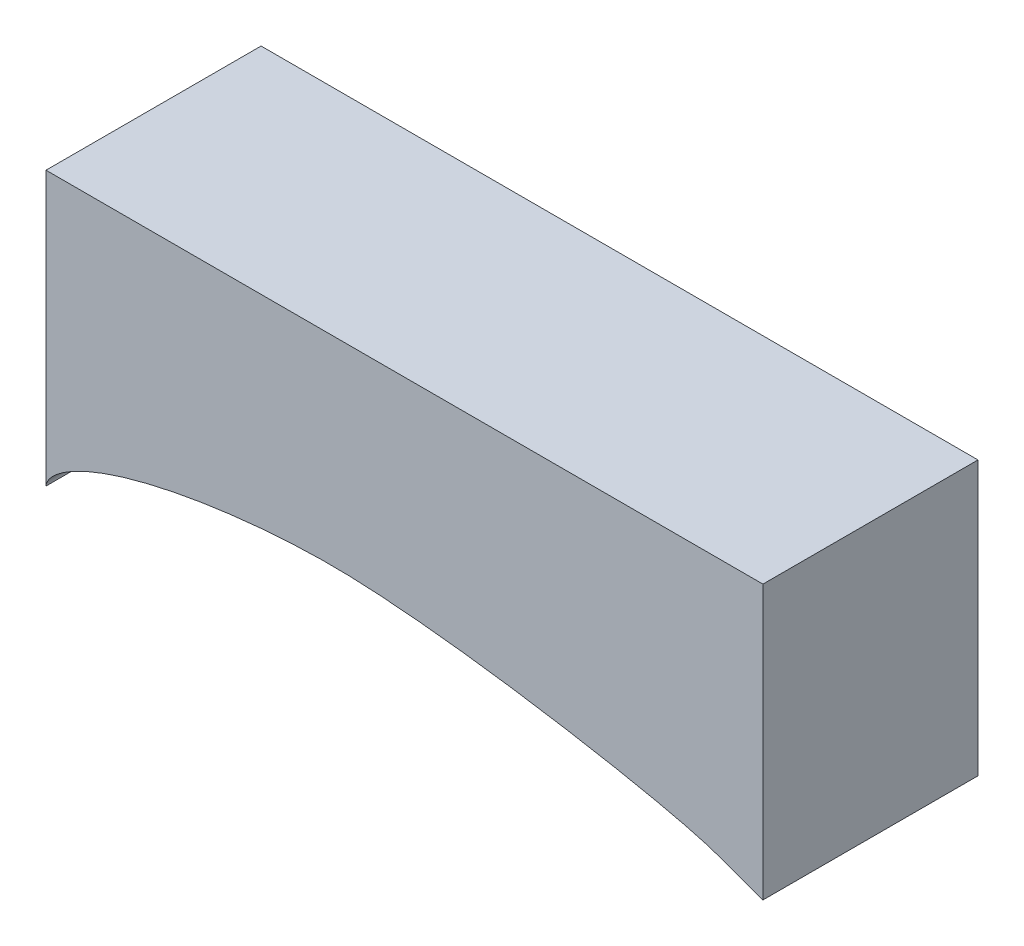
ISO-10303-21;
HEADER;
FILE_DESCRIPTION(('STEP AP214'),'2;1');
FILE_NAME('part.step','',(''),(''),'','','');
FILE_SCHEMA(('AUTOMOTIVE_DESIGN { 1 0 10303 214 1 1 1 1 }'));
ENDSEC;
DATA;
#1=APPLICATION_CONTEXT('core data for automotive mechanical design processes');
#2=APPLICATION_PROTOCOL_DEFINITION('international standard','automotive_design',2000,#1);
#3=PRODUCT_CONTEXT('',#1,'mechanical');
#4=PRODUCT('Part','Part','',(#3));
#5=PRODUCT_RELATED_PRODUCT_CATEGORY('part','',(#4));
#6=PRODUCT_DEFINITION_FORMATION('','',#4);
#7=PRODUCT_DEFINITION_CONTEXT('part definition',#1,'design');
#8=PRODUCT_DEFINITION('design','',#6,#7);
#9=PRODUCT_DEFINITION_SHAPE('','',#8);
#10=(LENGTH_UNIT() NAMED_UNIT(*) SI_UNIT(.MILLI.,.METRE.));
#11=(NAMED_UNIT(*) PLANE_ANGLE_UNIT() SI_UNIT($,.RADIAN.));
#12=(NAMED_UNIT(*) SI_UNIT($,.STERADIAN.) SOLID_ANGLE_UNIT());
#13=UNCERTAINTY_MEASURE_WITH_UNIT(LENGTH_MEASURE(1.E-05),#10,'distance_accuracy_value','');
#14=(GEOMETRIC_REPRESENTATION_CONTEXT(3) GLOBAL_UNCERTAINTY_ASSIGNED_CONTEXT((#13)) GLOBAL_UNIT_ASSIGNED_CONTEXT((#10,
#11,#12)) REPRESENTATION_CONTEXT('',''));
#15=CARTESIAN_POINT('',(0.,0.,0.));
#16=DIRECTION('',(0.,0.,1.));
#17=DIRECTION('',(1.,0.,0.));
#18=AXIS2_PLACEMENT_3D('',#15,#16,#17);
#19=CARTESIAN_POINT('',(100.,0.,30.));
#20=CARTESIAN_POINT('',(99.9998156509364,0.00219446047422512,30.));
#21=CARTESIAN_POINT('',(99.2960842626716,0.199325453500861,30.));
#22=CARTESIAN_POINT('',(98.619126090181,0.462023876152651,30.));
#23=CARTESIAN_POINT('',(97.0519039246836,1.04727160403521,30.));
#24=CARTESIAN_POINT('',(95.2308905611427,1.75489356170313,30.));
#25=CARTESIAN_POINT('',(92.9377883999997,2.55682262406311,30.));
#26=CARTESIAN_POINT('',(90.253595209805,3.33364669556734,30.));
#27=CARTESIAN_POINT('',(87.1476900902541,4.08159171713816,30.));
#28=CARTESIAN_POINT('',(83.6534535233071,4.84489294939738,30.));
#29=CARTESIAN_POINT('',(79.8050922783782,5.61262478938947,30.));
#30=CARTESIAN_POINT('',(75.655096386502,6.37817808174266,30.));
#31=CARTESIAN_POINT('',(71.2567750371295,7.1284211866885,30.));
#32=CARTESIAN_POINT('',(66.666591083815,7.84840862271711,30.));
#33=CARTESIAN_POINT('',(61.9422839876976,8.52124758203348,30.));
#34=CARTESIAN_POINT('',(57.1419916643488,9.12693532573033,30.));
#35=CARTESIAN_POINT('',(52.323298642329,9.64474489105086,30.));
#36=CARTESIAN_POINT('',(47.5421716345123,10.0466640945718,30.));
#37=CARTESIAN_POINT('',(42.8474128029864,10.315684788252,30.));
#38=CARTESIAN_POINT('',(38.2508590129801,10.3642373294133,30.));
#39=CARTESIAN_POINT('',(33.7665276305067,10.1858911603955,30.));
#40=CARTESIAN_POINT('',(29.4045407708241,9.85997953714068,30.));
#41=CARTESIAN_POINT('',(25.2056649179358,9.39633512244868,30.));
#42=CARTESIAN_POINT('',(21.2146329907838,8.8144764045113,30.));
#43=CARTESIAN_POINT('',(17.4732446171012,8.1296160960892,30.));
#44=CARTESIAN_POINT('',(14.0211027582914,7.35573873136707,30.));
#45=CARTESIAN_POINT('',(10.8931582983243,6.51004692488731,30.));
#46=CARTESIAN_POINT('',(8.12105740544501,5.60393899966372,30.));
#47=CARTESIAN_POINT('',(5.72962128075727,4.65858741987797,30.));
#48=CARTESIAN_POINT('',(3.73923883469922,3.68648252328311,30.));
#49=CARTESIAN_POINT('',(2.16290246553349,2.7162203503899,30.));
#50=CARTESIAN_POINT('',(1.00570220870081,1.76706228606803,30.));
#51=CARTESIAN_POINT('',(0.309881960884571,0.924053982718984,30.));
#52=CARTESIAN_POINT('',(0.0335623921127855,0.326864353298448,30.));
#53=CARTESIAN_POINT('',(0.000585058116756481,0.0590038319263769,30.));
#54=CARTESIAN_POINT('',(-0.000483324983572626,-0.0440553241565624,30.));
#55=CARTESIAN_POINT('',(0.00865655897641351,-0.147243842502105,30.));
#56=CARTESIAN_POINT('',(0.0976282148568061,-0.280738124086119,30.));
#57=CARTESIAN_POINT('',(0.217608326128965,-0.405627953622076,30.));
#58=CARTESIAN_POINT('',(0.606875055443502,-0.718520626599694,30.));
#59=CARTESIAN_POINT('',(1.51559341786082,-1.12387327993518,30.));
#60=CARTESIAN_POINT('',(3.07046981339313,-1.58299009342535,30.));
#61=CARTESIAN_POINT('',(5.15233849940049,-2.00716949321887,30.));
#62=CARTESIAN_POINT('',(7.72794701733534,-2.39169430673582,30.));
#63=CARTESIAN_POINT('',(10.7758632965451,-2.74988409949245,30.));
#64=CARTESIAN_POINT('',(14.251074500167,-3.0772124799214,30.));
#65=CARTESIAN_POINT('',(18.0406711254402,-3.47731503088619,30.));
#66=CARTESIAN_POINT('',(22.0414420337869,-3.90671848397194,30.));
#67=CARTESIAN_POINT('',(26.2166070486292,-4.11714527589637,30.));
#68=CARTESIAN_POINT('',(30.5565431080733,-4.09828552455342,30.));
#69=CARTESIAN_POINT('',(35.1013576121924,-3.84756636440319,30.));
#70=CARTESIAN_POINT('',(39.8555023988524,-3.29289641824458,30.));
#71=CARTESIAN_POINT('',(44.8530991506936,-2.56969491725158,30.));
#72=CARTESIAN_POINT('',(50.0777012636411,-1.6972464384225,30.));
#73=CARTESIAN_POINT('',(55.4969123049525,-0.808938968845193,30.));
#74=CARTESIAN_POINT('',(61.0344922062606,0.0244295388678754,30.));
#75=CARTESIAN_POINT('',(66.590101657332,0.742311193644087,30.));
#76=CARTESIAN_POINT('',(72.0549098572649,1.30128235901618,30.));
#77=CARTESIAN_POINT('',(77.3167133755177,1.67284440771095,30.));
#78=CARTESIAN_POINT('',(82.2607602188363,1.84173134146527,30.));
#79=CARTESIAN_POINT('',(86.7783991437203,1.81199551851271,30.));
#80=CARTESIAN_POINT('',(90.7288565877818,1.57974732032689,30.));
#81=CARTESIAN_POINT('',(94.0476487496997,1.18199750532775,30.));
#82=CARTESIAN_POINT('',(96.5243329790301,0.771531232095096,30.));
#83=CARTESIAN_POINT('',(98.4760244929446,0.356901303304398,30.));
#84=CARTESIAN_POINT('',(99.257250669849,0.188333084200799,30.));
#85=CARTESIAN_POINT('',(100.000186154411,-0.00221595103086352,30.));
#86=CARTESIAN_POINT('',(100.,0.,30.));
#87=B_SPLINE_CURVE_WITH_KNOTS('',3,(#19,#20,#21,#22,#23,#24,#25,#26,#27,#28,#29,#30,#31,#32,#33,
#34,#35,#36,#37,#38,#39,#40,#41,#42,#43,#44,#45,#46,#47,#48,#49,#50,#51,#52,#53,#54,#55,#56,#57,
#58,#59,#60,#61,#62,#63,#64,#65,#66,#67,#68,#69,#70,#71,#72,#73,#74,#75,#76,#77,#78,#79,#80,#81,
#82,#83,#84,#85,#86),.UNSPECIFIED.,.T.,.F.,(4,1,1,1,1,1,1,1,1,1,1,1,1,1,1,1,1,1,1,1,1,1,1,1,1,1,
1,1,1,1,1,1,1,1,1,1,1,1,1,1,1,1,1,1,1,1,1,1,1,1,1,1,1,1,1,1,1,1,1,1,1,1,1,1,1,4),(0.,
0.00170934634356601,0.00665456907472903,0.0143478493466078,0.0242594017057008,
0.0360417113890698,0.0496411159070593,0.0652547122672095,0.0827925347805582,0.102030591413806,
0.122721355866262,0.144596581278119,0.167375108700504,0.19076763878564,0.214482745024348,
0.238232802588826,0.261741379201132,0.284746803493425,0.307088371297225,0.329034070783988,
0.350454747563366,0.371139118049059,0.39089001909001,0.409511982282434,0.426831343781302,
0.442689348385407,0.4569497130243,0.469522755711217,0.480321822491961,0.489349766891022,
0.496580446347408,0.502134718441263,0.505253956973586,0.506016052269303,0.506062920949655,
0.506764306428777,0.507485535157146,0.508355903878622,0.509303966916285,0.514776147768379,
0.522722026188772,0.533080485530412,0.545839740853263,0.560863122591566,0.578017517003329,
0.596961029849698,0.616674639918331,0.636937396473689,0.6581483458223,0.68021144509927,
0.703561467075347,0.728221439111702,0.754163513980227,0.781135914110858,0.808648743307018,
0.836174178106489,0.863169877369038,0.889092096600814,0.913409262200501,0.935618429663885,
0.955186622460157,0.971480112027089,0.984125393112693,0.993028694310693,0.998273913867842,1.),.UNSPECIFIED.);
#88=DIRECTION('',(0.,0.,-1.));
#89=VECTOR('',#88,1.);
#90=SURFACE_OF_LINEAR_EXTRUSION('',#87,#89);
#91=CARTESIAN_POINT('',(100.,0.,0.));
#92=CARTESIAN_POINT('',(99.9998156509364,0.00219446047422512,0.));
#93=CARTESIAN_POINT('',(99.2960842626716,0.199325453500861,0.));
#94=CARTESIAN_POINT('',(98.619126090181,0.462023876152651,0.));
#95=CARTESIAN_POINT('',(97.0519039246836,1.04727160403521,0.));
#96=CARTESIAN_POINT('',(95.2308905611427,1.75489356170313,0.));
#97=CARTESIAN_POINT('',(92.9377883999997,2.55682262406311,0.));
#98=CARTESIAN_POINT('',(90.253595209805,3.33364669556734,0.));
#99=CARTESIAN_POINT('',(87.1476900902541,4.08159171713816,0.));
#100=CARTESIAN_POINT('',(83.6534535233071,4.84489294939738,0.));
#101=CARTESIAN_POINT('',(79.8050922783782,5.61262478938947,0.));
#102=CARTESIAN_POINT('',(75.655096386502,6.37817808174266,0.));
#103=CARTESIAN_POINT('',(71.2567750371295,7.1284211866885,0.));
#104=CARTESIAN_POINT('',(66.666591083815,7.84840862271711,0.));
#105=CARTESIAN_POINT('',(61.9422839876976,8.52124758203348,0.));
#106=CARTESIAN_POINT('',(57.1419916643488,9.12693532573033,0.));
#107=CARTESIAN_POINT('',(52.323298642329,9.64474489105086,0.));
#108=CARTESIAN_POINT('',(47.5421716345123,10.0466640945718,0.));
#109=CARTESIAN_POINT('',(42.8474128029864,10.315684788252,0.));
#110=CARTESIAN_POINT('',(38.2508590129801,10.3642373294133,0.));
#111=CARTESIAN_POINT('',(33.7665276305067,10.1858911603955,0.));
#112=CARTESIAN_POINT('',(29.4045407708241,9.85997953714068,0.));
#113=CARTESIAN_POINT('',(25.2056649179358,9.39633512244868,0.));
#114=CARTESIAN_POINT('',(21.2146329907838,8.8144764045113,0.));
#115=CARTESIAN_POINT('',(17.4732446171012,8.1296160960892,0.));
#116=CARTESIAN_POINT('',(14.0211027582914,7.35573873136707,0.));
#117=CARTESIAN_POINT('',(10.8931582983243,6.51004692488731,0.));
#118=CARTESIAN_POINT('',(8.12105740544501,5.60393899966372,0.));
#119=CARTESIAN_POINT('',(5.72962128075727,4.65858741987797,0.));
#120=CARTESIAN_POINT('',(3.73923883469922,3.68648252328311,0.));
#121=CARTESIAN_POINT('',(2.16290246553349,2.7162203503899,0.));
#122=CARTESIAN_POINT('',(1.00570220870081,1.76706228606803,0.));
#123=CARTESIAN_POINT('',(0.309881960884571,0.924053982718984,0.));
#124=CARTESIAN_POINT('',(0.0335623921127855,0.326864353298448,0.));
#125=CARTESIAN_POINT('',(0.000585058116756481,0.0590038319263769,0.));
#126=CARTESIAN_POINT('',(-0.000483324983572626,-0.0440553241565624,0.));
#127=CARTESIAN_POINT('',(0.00865655897641351,-0.147243842502105,0.));
#128=CARTESIAN_POINT('',(0.0976282148568061,-0.280738124086119,0.));
#129=CARTESIAN_POINT('',(0.217608326128965,-0.405627953622076,0.));
#130=CARTESIAN_POINT('',(0.606875055443502,-0.718520626599694,0.));
#131=CARTESIAN_POINT('',(1.51559341786082,-1.12387327993518,0.));
#132=CARTESIAN_POINT('',(3.07046981339313,-1.58299009342535,0.));
#133=CARTESIAN_POINT('',(5.15233849940049,-2.00716949321887,0.));
#134=CARTESIAN_POINT('',(7.72794701733534,-2.39169430673582,0.));
#135=CARTESIAN_POINT('',(10.7758632965451,-2.74988409949245,0.));
#136=CARTESIAN_POINT('',(14.251074500167,-3.0772124799214,0.));
#137=CARTESIAN_POINT('',(18.0406711254402,-3.47731503088619,0.));
#138=CARTESIAN_POINT('',(22.0414420337869,-3.90671848397194,0.));
#139=CARTESIAN_POINT('',(26.2166070486292,-4.11714527589637,0.));
#140=CARTESIAN_POINT('',(30.5565431080733,-4.09828552455342,0.));
#141=CARTESIAN_POINT('',(35.1013576121924,-3.84756636440319,0.));
#142=CARTESIAN_POINT('',(39.8555023988524,-3.29289641824458,0.));
#143=CARTESIAN_POINT('',(44.8530991506936,-2.56969491725158,0.));
#144=CARTESIAN_POINT('',(50.0777012636411,-1.6972464384225,0.));
#145=CARTESIAN_POINT('',(55.4969123049525,-0.808938968845193,0.));
#146=CARTESIAN_POINT('',(61.0344922062606,0.0244295388678754,0.));
#147=CARTESIAN_POINT('',(66.590101657332,0.742311193644087,0.));
#148=CARTESIAN_POINT('',(72.0549098572649,1.30128235901618,0.));
#149=CARTESIAN_POINT('',(77.3167133755177,1.67284440771095,0.));
#150=CARTESIAN_POINT('',(82.2607602188363,1.84173134146527,0.));
#151=CARTESIAN_POINT('',(86.7783991437203,1.81199551851271,0.));
#152=CARTESIAN_POINT('',(90.7288565877818,1.57974732032689,0.));
#153=CARTESIAN_POINT('',(94.0476487496997,1.18199750532775,0.));
#154=CARTESIAN_POINT('',(96.5243329790301,0.771531232095096,0.));
#155=CARTESIAN_POINT('',(98.4760244929446,0.356901303304398,0.));
#156=CARTESIAN_POINT('',(99.257250669849,0.188333084200799,0.));
#157=CARTESIAN_POINT('',(100.000186154411,-0.00221595103086352,0.));
#158=CARTESIAN_POINT('',(100.,0.,0.));
#159=B_SPLINE_CURVE_WITH_KNOTS('',3,(#91,#92,#93,#94,#95,#96,#97,#98,#99,#100,#101,#102,#103,
#104,#105,#106,#107,#108,#109,#110,#111,#112,#113,#114,#115,#116,#117,#118,#119,#120,#121,#122,
#123,#124,#125,#126,#127,#128,#129,#130,#131,#132,#133,#134,#135,#136,#137,#138,#139,#140,#141,
#142,#143,#144,#145,#146,#147,#148,#149,#150,#151,#152,#153,#154,#155,#156,#157,#158),
.UNSPECIFIED.,.T.,.F.,(4,1,1,1,1,1,1,1,1,1,1,1,1,1,1,1,1,1,1,1,1,1,1,1,1,1,1,1,1,1,1,1,1,1,1,1,
1,1,1,1,1,1,1,1,1,1,1,1,1,1,1,1,1,1,1,1,1,1,1,1,1,1,1,1,1,4),(0.,0.00170934634356601,
0.00665456907472903,0.0143478493466078,0.0242594017057008,0.0360417113890698,0.0496411159070593,
0.0652547122672095,0.0827925347805582,0.102030591413806,0.122721355866262,0.144596581278119,
0.167375108700504,0.19076763878564,0.214482745024348,0.238232802588826,0.261741379201132,
0.284746803493425,0.307088371297225,0.329034070783988,0.350454747563366,0.371139118049059,
0.39089001909001,0.409511982282434,0.426831343781302,0.442689348385407,0.4569497130243,
0.469522755711217,0.480321822491961,0.489349766891022,0.496580446347408,0.502134718441263,
0.505253956973586,0.506016052269303,0.506062920949655,0.506764306428777,0.507485535157146,
0.508355903878622,0.509303966916285,0.514776147768379,0.522722026188772,0.533080485530412,
0.545839740853263,0.560863122591566,0.578017517003329,0.596961029849698,0.616674639918331,
0.636937396473689,0.6581483458223,0.68021144509927,0.703561467075347,0.728221439111702,
0.754163513980227,0.781135914110858,0.808648743307018,0.836174178106489,0.863169877369038,
0.889092096600814,0.913409262200501,0.935618429663885,0.955186622460157,0.971480112027089,
0.984125393112693,0.993028694310693,0.998273913867842,1.),.UNSPECIFIED.);
#160=CARTESIAN_POINT('',(100.,0.,0.));
#161=VERTEX_POINT('',#160);
#162=CARTESIAN_POINT('',(0.,0.,0.));
#163=VERTEX_POINT('',#162);
#164=EDGE_CURVE('E113',#161,#163,#159,.T.);
#165=ORIENTED_EDGE('',*,*,#164,.F.);
#166=DIRECTION('',(0.,0.,-1.));
#167=VECTOR('',#166,1.);
#168=CARTESIAN_POINT('',(100.,0.,30.));
#169=LINE('',#168,#167);
#170=CARTESIAN_POINT('',(100.,0.,30.));
#171=VERTEX_POINT('',#170);
#172=EDGE_CURVE('E11',#171,#161,#169,.T.);
#173=ORIENTED_EDGE('',*,*,#172,.F.);
#174=CARTESIAN_POINT('',(0.,0.,30.));
#175=VERTEX_POINT('',#174);
#176=EDGE_CURVE('E103',#171,#175,#87,.T.);
#177=ORIENTED_EDGE('',*,*,#176,.T.);
#178=DIRECTION('',(0.,0.,-1.));
#179=VECTOR('',#178,1.);
#180=CARTESIAN_POINT('',(0.,0.,30.));
#181=LINE('',#180,#179);
#182=EDGE_CURVE('E63',#175,#163,#181,.T.);
#183=ORIENTED_EDGE('',*,*,#182,.T.);
#184=EDGE_LOOP('',(#165,#173,#177,#183));
#185=FACE_BOUND('',#184,.T.);
#186=ADVANCED_FACE('F45',(#185),#90,.T.);
#187=CARTESIAN_POINT('',(100.,0.,30.));
#188=DIRECTION('',(1.,0.,0.));
#189=DIRECTION('',(0.,1.,0.));
#190=AXIS2_PLACEMENT_3D('',#187,#188,#189);
#191=PLANE('',#190);
#192=DIRECTION('',(0.,-1.,0.));
#193=VECTOR('',#192,1.);
#194=CARTESIAN_POINT('',(100.,0.,0.));
#195=LINE('',#194,#193);
#196=CARTESIAN_POINT('',(100.,38.1592575820124,0.));
#197=VERTEX_POINT('',#196);
#198=EDGE_CURVE('E93',#197,#161,#195,.T.);
#199=ORIENTED_EDGE('',*,*,#198,.F.);
#200=DIRECTION('',(0.,0.,-1.));
#201=VECTOR('',#200,1.);
#202=CARTESIAN_POINT('',(100.,38.1592575820124,30.));
#203=LINE('',#202,#201);
#204=CARTESIAN_POINT('',(100.,38.1592575820124,30.));
#205=VERTEX_POINT('',#204);
#206=EDGE_CURVE('E55',#205,#197,#203,.T.);
#207=ORIENTED_EDGE('',*,*,#206,.F.);
#208=DIRECTION('',(0.,-1.,0.));
#209=VECTOR('',#208,1.);
#210=CARTESIAN_POINT('',(100.,0.,30.));
#211=LINE('',#210,#209);
#212=EDGE_CURVE('E91',#205,#171,#211,.T.);
#213=ORIENTED_EDGE('',*,*,#212,.T.);
#214=ORIENTED_EDGE('',*,*,#172,.T.);
#215=EDGE_LOOP('',(#199,#207,#213,#214));
#216=FACE_BOUND('',#215,.T.);
#217=ADVANCED_FACE('F90',(#216),#191,.T.);
#218=CARTESIAN_POINT('',(0.,38.1592575820124,30.));
#219=DIRECTION('',(0.,1.,0.));
#220=DIRECTION('',(0.,0.,1.));
#221=AXIS2_PLACEMENT_3D('',#218,#219,#220);
#222=PLANE('',#221);
#223=DIRECTION('',(1.,0.,0.));
#224=VECTOR('',#223,1.);
#225=CARTESIAN_POINT('',(0.,38.1592575820124,0.));
#226=LINE('',#225,#224);
#227=CARTESIAN_POINT('',(0.,38.1592575820124,0.));
#228=VERTEX_POINT('',#227);
#229=EDGE_CURVE('E123',#228,#197,#226,.T.);
#230=ORIENTED_EDGE('',*,*,#229,.F.);
#231=DIRECTION('',(0.,0.,-1.));
#232=VECTOR('',#231,1.);
#233=CARTESIAN_POINT('',(0.,38.1592575820124,30.));
#234=LINE('',#233,#232);
#235=CARTESIAN_POINT('',(0.,38.1592575820124,30.));
#236=VERTEX_POINT('',#235);
#237=EDGE_CURVE('E76',#236,#228,#234,.T.);
#238=ORIENTED_EDGE('',*,*,#237,.F.);
#239=DIRECTION('',(1.,0.,0.));
#240=VECTOR('',#239,1.);
#241=CARTESIAN_POINT('',(0.,38.1592575820124,30.));
#242=LINE('',#241,#240);
#243=EDGE_CURVE('E102',#236,#205,#242,.T.);
#244=ORIENTED_EDGE('',*,*,#243,.T.);
#245=ORIENTED_EDGE('',*,*,#206,.T.);
#246=EDGE_LOOP('',(#230,#238,#244,#245));
#247=FACE_BOUND('',#246,.T.);
#248=ADVANCED_FACE('F106',(#247),#222,.T.);
#249=CARTESIAN_POINT('',(0.,0.,30.));
#250=DIRECTION('',(-1.,0.,0.));
#251=DIRECTION('',(0.,0.,1.));
#252=AXIS2_PLACEMENT_3D('',#249,#250,#251);
#253=PLANE('',#252);
#254=DIRECTION('',(0.,1.,0.));
#255=VECTOR('',#254,1.);
#256=CARTESIAN_POINT('',(0.,0.,0.));
#257=LINE('',#256,#255);
#258=EDGE_CURVE('E126',#163,#228,#257,.T.);
#259=ORIENTED_EDGE('',*,*,#258,.F.);
#260=ORIENTED_EDGE('',*,*,#182,.F.);
#261=DIRECTION('',(0.,1.,0.));
#262=VECTOR('',#261,1.);
#263=CARTESIAN_POINT('',(0.,0.,30.));
#264=LINE('',#263,#262);
#265=EDGE_CURVE('E108',#175,#236,#264,.T.);
#266=ORIENTED_EDGE('',*,*,#265,.T.);
#267=ORIENTED_EDGE('',*,*,#237,.T.);
#268=EDGE_LOOP('',(#259,#260,#266,#267));
#269=FACE_BOUND('',#268,.T.);
#270=ADVANCED_FACE('F141',(#269),#253,.T.);
#271=CARTESIAN_POINT('',(0.,0.,30.));
#272=DIRECTION('',(0.,0.,1.));
#273=DIRECTION('',(1.,0.,0.));
#274=AXIS2_PLACEMENT_3D('',#271,#272,#273);
#275=PLANE('',#274);
#276=ORIENTED_EDGE('',*,*,#176,.F.);
#277=ORIENTED_EDGE('',*,*,#212,.F.);
#278=ORIENTED_EDGE('',*,*,#243,.F.);
#279=ORIENTED_EDGE('',*,*,#265,.F.);
#280=EDGE_LOOP('',(#276,#277,#278,#279));
#281=FACE_BOUND('',#280,.T.);
#282=ADVANCED_FACE('F100',(#281),#275,.T.);
#283=CARTESIAN_POINT('',(0.,0.,0.));
#284=DIRECTION('',(0.,0.,1.));
#285=DIRECTION('',(1.,0.,0.));
#286=AXIS2_PLACEMENT_3D('',#283,#284,#285);
#287=PLANE('',#286);
#288=ORIENTED_EDGE('',*,*,#164,.T.);
#289=ORIENTED_EDGE('',*,*,#258,.T.);
#290=ORIENTED_EDGE('',*,*,#229,.T.);
#291=ORIENTED_EDGE('',*,*,#198,.T.);
#292=EDGE_LOOP('',(#288,#289,#290,#291));
#293=FACE_BOUND('',#292,.T.);
#294=ADVANCED_FACE('F148',(#293),#287,.F.);
#295=CLOSED_SHELL('',(#186,#217,#248,#270,#282,#294));
#296=MANIFOLD_SOLID_BREP('B2',#295);
#297=ADVANCED_BREP_SHAPE_REPRESENTATION('',(#18,#296),#14);
#298=SHAPE_DEFINITION_REPRESENTATION(#9,#297);
ENDSEC;
END-ISO-10303-21;
